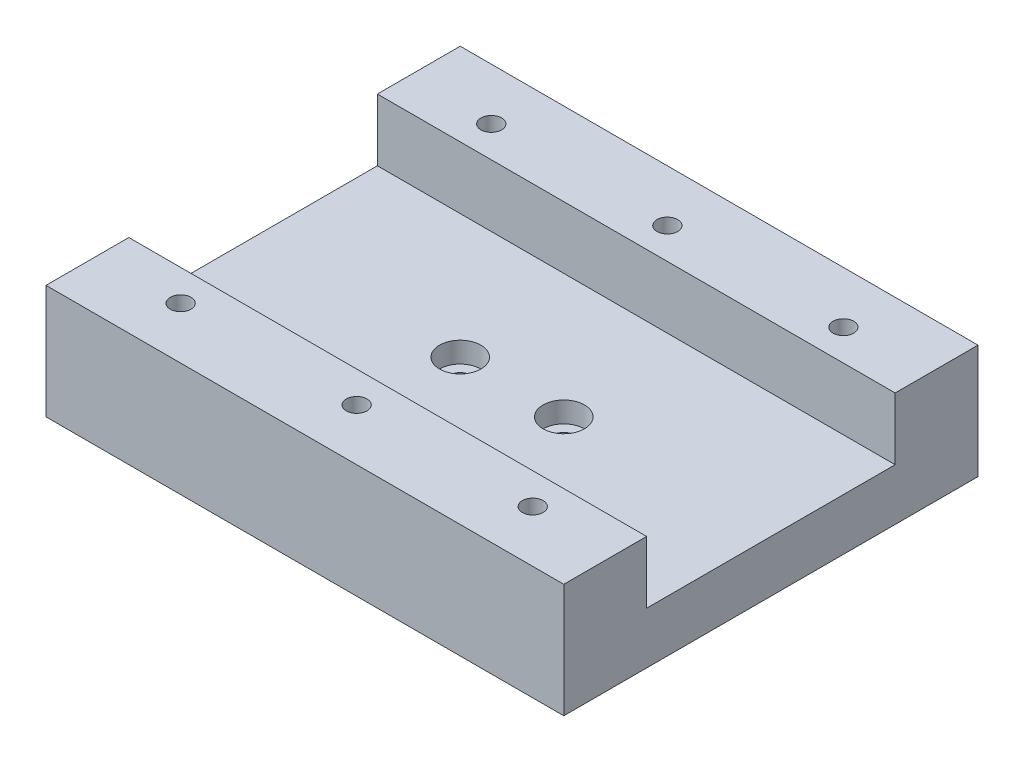
ISO-10303-21;
HEADER;
FILE_DESCRIPTION(('STEP AP214'),'2;1');
FILE_NAME('part.step','',(''),(''),'','','');
FILE_SCHEMA(('AUTOMOTIVE_DESIGN { 1 0 10303 214 1 1 1 1 }'));
ENDSEC;
DATA;
#1=APPLICATION_CONTEXT('core data for automotive mechanical design processes');
#2=APPLICATION_PROTOCOL_DEFINITION('international standard','automotive_design',2000,#1);
#3=PRODUCT_CONTEXT('',#1,'mechanical');
#4=PRODUCT('Part','Part','',(#3));
#5=PRODUCT_RELATED_PRODUCT_CATEGORY('part','',(#4));
#6=PRODUCT_DEFINITION_FORMATION('','',#4);
#7=PRODUCT_DEFINITION_CONTEXT('part definition',#1,'design');
#8=PRODUCT_DEFINITION('design','',#6,#7);
#9=PRODUCT_DEFINITION_SHAPE('','',#8);
#10=(LENGTH_UNIT() NAMED_UNIT(*) SI_UNIT(.MILLI.,.METRE.));
#11=(NAMED_UNIT(*) PLANE_ANGLE_UNIT() SI_UNIT($,.RADIAN.));
#12=(NAMED_UNIT(*) SI_UNIT($,.STERADIAN.) SOLID_ANGLE_UNIT());
#13=UNCERTAINTY_MEASURE_WITH_UNIT(LENGTH_MEASURE(1.E-05),#10,'distance_accuracy_value','');
#14=(GEOMETRIC_REPRESENTATION_CONTEXT(3) GLOBAL_UNCERTAINTY_ASSIGNED_CONTEXT((#13)) GLOBAL_UNIT_ASSIGNED_CONTEXT((#10,
#11,#12)) REPRESENTATION_CONTEXT('',''));
#15=CARTESIAN_POINT('',(0.,0.,0.));
#16=DIRECTION('',(0.,0.,1.));
#17=DIRECTION('',(1.,0.,0.));
#18=AXIS2_PLACEMENT_3D('',#15,#16,#17);
#19=CARTESIAN_POINT('',(0.,5.,0.));
#20=DIRECTION('',(0.,1.,0.));
#21=DIRECTION('',(0.,0.,1.));
#22=AXIS2_PLACEMENT_3D('',#19,#20,#21);
#23=PLANE('',#22);
#24=CARTESIAN_POINT('',(-5.,5.,0.));
#25=DIRECTION('',(0.,1.,0.));
#26=DIRECTION('',(0.,0.,1.));
#27=AXIS2_PLACEMENT_3D('',#24,#25,#26);
#28=CIRCLE('',#27,2.);
#29=CARTESIAN_POINT('',(-5.,5.,2.));
#30=VERTEX_POINT('',#29);
#31=EDGE_CURVE('E156',#30,#30,#28,.T.);
#32=ORIENTED_EDGE('',*,*,#31,.F.);
#33=EDGE_LOOP('',(#32));
#34=FACE_BOUND('',#33,.T.);
#35=CARTESIAN_POINT('',(5.,5.,0.));
#36=DIRECTION('',(0.,1.,0.));
#37=DIRECTION('',(0.,0.,1.));
#38=AXIS2_PLACEMENT_3D('',#35,#36,#37);
#39=CIRCLE('',#38,2.);
#40=CARTESIAN_POINT('',(5.,5.,2.));
#41=VERTEX_POINT('',#40);
#42=EDGE_CURVE('E161',#41,#41,#39,.T.);
#43=ORIENTED_EDGE('',*,*,#42,.F.);
#44=EDGE_LOOP('',(#43));
#45=FACE_BOUND('',#44,.T.);
#46=DIRECTION('',(0.,0.,1.));
#47=VECTOR('',#46,1.);
#48=CARTESIAN_POINT('',(-25.,5.,-20.));
#49=LINE('',#48,#47);
#50=CARTESIAN_POINT('',(-25.,5.,-12.));
#51=VERTEX_POINT('',#50);
#52=CARTESIAN_POINT('',(-25.,5.,12.));
#53=VERTEX_POINT('',#52);
#54=EDGE_CURVE('E121',#51,#53,#49,.T.);
#55=ORIENTED_EDGE('',*,*,#54,.T.);
#56=DIRECTION('',(-1.,0.,0.));
#57=VECTOR('',#56,1.);
#58=CARTESIAN_POINT('',(-25.,5.,12.));
#59=LINE('',#58,#57);
#60=CARTESIAN_POINT('',(25.,5.,12.));
#61=VERTEX_POINT('',#60);
#62=EDGE_CURVE('E110',#61,#53,#59,.T.);
#63=ORIENTED_EDGE('',*,*,#62,.F.);
#64=DIRECTION('',(0.,0.,-1.));
#65=VECTOR('',#64,1.);
#66=CARTESIAN_POINT('',(25.,5.,-20.));
#67=LINE('',#66,#65);
#68=CARTESIAN_POINT('',(25.,5.,-12.));
#69=VERTEX_POINT('',#68);
#70=EDGE_CURVE('E127',#61,#69,#67,.T.);
#71=ORIENTED_EDGE('',*,*,#70,.T.);
#72=DIRECTION('',(1.,0.,0.));
#73=VECTOR('',#72,1.);
#74=CARTESIAN_POINT('',(-25.,5.,-12.));
#75=LINE('',#74,#73);
#76=EDGE_CURVE('E68',#51,#69,#75,.T.);
#77=ORIENTED_EDGE('',*,*,#76,.F.);
#78=EDGE_LOOP('',(#55,#63,#71,#77));
#79=FACE_BOUND('',#78,.T.);
#80=ADVANCED_FACE('F43',(#34,#45,#79),#23,.T.);
#81=CARTESIAN_POINT('',(5.,0.,0.));
#82=DIRECTION('',(0.,1.,0.));
#83=DIRECTION('',(0.,0.,1.));
#84=AXIS2_PLACEMENT_3D('',#81,#82,#83);
#85=CYLINDRICAL_SURFACE('',#84,1.);
#86=CARTESIAN_POINT('',(5.,0.,0.));
#87=DIRECTION('',(0.,1.,0.));
#88=DIRECTION('',(0.,0.,1.));
#89=AXIS2_PLACEMENT_3D('',#86,#87,#88);
#90=CIRCLE('',#89,1.);
#91=CARTESIAN_POINT('',(5.,0.,0.999999999999998));
#92=VERTEX_POINT('',#91);
#93=EDGE_CURVE('E154',#92,#92,#90,.T.);
#94=ORIENTED_EDGE('',*,*,#93,.F.);
#95=EDGE_LOOP('',(#94));
#96=FACE_BOUND('',#95,.T.);
#97=CARTESIAN_POINT('',(5.,3.,0.));
#98=DIRECTION('',(0.,1.,0.));
#99=DIRECTION('',(0.,0.,1.));
#100=AXIS2_PLACEMENT_3D('',#97,#98,#99);
#101=CIRCLE('',#100,1.);
#102=CARTESIAN_POINT('',(5.,3.,0.999999999999998));
#103=VERTEX_POINT('',#102);
#104=EDGE_CURVE('E47',#103,#103,#101,.F.);
#105=ORIENTED_EDGE('',*,*,#104,.F.);
#106=EDGE_LOOP('',(#105));
#107=FACE_BOUND('',#106,.T.);
#108=ADVANCED_FACE('F179',(#96,#107),#85,.F.);
#109=CARTESIAN_POINT('',(-5.,0.,0.));
#110=DIRECTION('',(0.,1.,0.));
#111=DIRECTION('',(0.,0.,1.));
#112=AXIS2_PLACEMENT_3D('',#109,#110,#111);
#113=CYLINDRICAL_SURFACE('',#112,1.);
#114=CARTESIAN_POINT('',(-5.,0.,0.));
#115=DIRECTION('',(0.,1.,0.));
#116=DIRECTION('',(0.,0.,1.));
#117=AXIS2_PLACEMENT_3D('',#114,#115,#116);
#118=CIRCLE('',#117,1.);
#119=CARTESIAN_POINT('',(-5.,0.,1.));
#120=VERTEX_POINT('',#119);
#121=EDGE_CURVE('E140',#120,#120,#118,.T.);
#122=ORIENTED_EDGE('',*,*,#121,.F.);
#123=EDGE_LOOP('',(#122));
#124=FACE_BOUND('',#123,.T.);
#125=CARTESIAN_POINT('',(-5.,3.,0.));
#126=DIRECTION('',(0.,1.,0.));
#127=DIRECTION('',(0.,0.,1.));
#128=AXIS2_PLACEMENT_3D('',#125,#126,#127);
#129=CIRCLE('',#128,1.);
#130=CARTESIAN_POINT('',(-5.,3.,1.));
#131=VERTEX_POINT('',#130);
#132=EDGE_CURVE('E148',#131,#131,#129,.F.);
#133=ORIENTED_EDGE('',*,*,#132,.F.);
#134=EDGE_LOOP('',(#133));
#135=FACE_BOUND('',#134,.T.);
#136=ADVANCED_FACE('F182',(#124,#135),#113,.F.);
#137=CARTESIAN_POINT('',(25.,5.,-20.));
#138=DIRECTION('',(-1.,0.,0.));
#139=DIRECTION('',(0.,0.,1.));
#140=AXIS2_PLACEMENT_3D('',#137,#138,#139);
#141=PLANE('',#140);
#142=DIRECTION('',(0.,0.,-1.));
#143=VECTOR('',#142,1.);
#144=CARTESIAN_POINT('',(25.,0.,-20.));
#145=LINE('',#144,#143);
#146=CARTESIAN_POINT('',(25.,0.,20.));
#147=VERTEX_POINT('',#146);
#148=CARTESIAN_POINT('',(25.,0.,-20.));
#149=VERTEX_POINT('',#148);
#150=EDGE_CURVE('E136',#147,#149,#145,.T.);
#151=ORIENTED_EDGE('',*,*,#150,.T.);
#152=DIRECTION('',(0.,-1.,0.));
#153=VECTOR('',#152,1.);
#154=CARTESIAN_POINT('',(25.,5.,-20.));
#155=LINE('',#154,#153);
#156=CARTESIAN_POINT('',(25.,11.,-20.));
#157=VERTEX_POINT('',#156);
#158=EDGE_CURVE('E11',#157,#149,#155,.T.);
#159=ORIENTED_EDGE('',*,*,#158,.F.);
#160=DIRECTION('',(0.,0.,-1.));
#161=VECTOR('',#160,1.);
#162=CARTESIAN_POINT('',(25.,11.,-20.));
#163=LINE('',#162,#161);
#164=CARTESIAN_POINT('',(25.,11.,-12.));
#165=VERTEX_POINT('',#164);
#166=EDGE_CURVE('E250',#165,#157,#163,.T.);
#167=ORIENTED_EDGE('',*,*,#166,.F.);
#168=DIRECTION('',(0.,-1.,0.));
#169=VECTOR('',#168,1.);
#170=CARTESIAN_POINT('',(25.,11.,-12.));
#171=LINE('',#170,#169);
#172=EDGE_CURVE('E255',#165,#69,#171,.T.);
#173=ORIENTED_EDGE('',*,*,#172,.T.);
#174=ORIENTED_EDGE('',*,*,#70,.F.);
#175=DIRECTION('',(0.,-1.,0.));
#176=VECTOR('',#175,1.);
#177=CARTESIAN_POINT('',(25.,11.,12.));
#178=LINE('',#177,#176);
#179=CARTESIAN_POINT('',(25.,11.,12.));
#180=VERTEX_POINT('',#179);
#181=EDGE_CURVE('E60',#180,#61,#178,.T.);
#182=ORIENTED_EDGE('',*,*,#181,.F.);
#183=DIRECTION('',(0.,0.,-1.));
#184=VECTOR('',#183,1.);
#185=CARTESIAN_POINT('',(25.,11.,20.));
#186=LINE('',#185,#184);
#187=CARTESIAN_POINT('',(25.,11.,20.));
#188=VERTEX_POINT('',#187);
#189=EDGE_CURVE('E239',#188,#180,#186,.T.);
#190=ORIENTED_EDGE('',*,*,#189,.F.);
#191=DIRECTION('',(0.,-1.,0.));
#192=VECTOR('',#191,1.);
#193=CARTESIAN_POINT('',(25.,5.,20.));
#194=LINE('',#193,#192);
#195=EDGE_CURVE('E126',#188,#147,#194,.T.);
#196=ORIENTED_EDGE('',*,*,#195,.T.);
#197=EDGE_LOOP('',(#151,#159,#167,#173,#174,#182,#190,#196));
#198=FACE_BOUND('',#197,.T.);
#199=ADVANCED_FACE('F45',(#198),#141,.F.);
#200=CARTESIAN_POINT('',(-25.,5.,-20.));
#201=DIRECTION('',(0.,0.,1.));
#202=DIRECTION('',(1.,0.,0.));
#203=AXIS2_PLACEMENT_3D('',#200,#201,#202);
#204=PLANE('',#203);
#205=DIRECTION('',(-1.,0.,0.));
#206=VECTOR('',#205,1.);
#207=CARTESIAN_POINT('',(-25.,0.,-20.));
#208=LINE('',#207,#206);
#209=CARTESIAN_POINT('',(-25.,0.,-20.));
#210=VERTEX_POINT('',#209);
#211=EDGE_CURVE('E139',#149,#210,#208,.T.);
#212=ORIENTED_EDGE('',*,*,#211,.T.);
#213=DIRECTION('',(0.,-1.,0.));
#214=VECTOR('',#213,1.);
#215=CARTESIAN_POINT('',(-25.,5.,-20.));
#216=LINE('',#215,#214);
#217=CARTESIAN_POINT('',(-25.,11.,-20.));
#218=VERTEX_POINT('',#217);
#219=EDGE_CURVE('E52',#218,#210,#216,.T.);
#220=ORIENTED_EDGE('',*,*,#219,.F.);
#221=DIRECTION('',(-1.,0.,0.));
#222=VECTOR('',#221,1.);
#223=CARTESIAN_POINT('',(-25.,11.,-20.));
#224=LINE('',#223,#222);
#225=EDGE_CURVE('E253',#157,#218,#224,.T.);
#226=ORIENTED_EDGE('',*,*,#225,.F.);
#227=ORIENTED_EDGE('',*,*,#158,.T.);
#228=EDGE_LOOP('',(#212,#220,#226,#227));
#229=FACE_BOUND('',#228,.T.);
#230=ADVANCED_FACE('F221',(#229),#204,.F.);
#231=CARTESIAN_POINT('',(-25.,5.,-20.));
#232=DIRECTION('',(1.,0.,0.));
#233=DIRECTION('',(0.,0.,-1.));
#234=AXIS2_PLACEMENT_3D('',#231,#232,#233);
#235=PLANE('',#234);
#236=DIRECTION('',(0.,0.,1.));
#237=VECTOR('',#236,1.);
#238=CARTESIAN_POINT('',(-25.,0.,-20.));
#239=LINE('',#238,#237);
#240=CARTESIAN_POINT('',(-25.,0.,20.));
#241=VERTEX_POINT('',#240);
#242=EDGE_CURVE('E142',#210,#241,#239,.T.);
#243=ORIENTED_EDGE('',*,*,#242,.T.);
#244=DIRECTION('',(0.,-1.,0.));
#245=VECTOR('',#244,1.);
#246=CARTESIAN_POINT('',(-25.,5.,20.));
#247=LINE('',#246,#245);
#248=CARTESIAN_POINT('',(-25.,11.,20.));
#249=VERTEX_POINT('',#248);
#250=EDGE_CURVE('E130',#249,#241,#247,.T.);
#251=ORIENTED_EDGE('',*,*,#250,.F.);
#252=DIRECTION('',(0.,0.,1.));
#253=VECTOR('',#252,1.);
#254=CARTESIAN_POINT('',(-25.,11.,20.));
#255=LINE('',#254,#253);
#256=CARTESIAN_POINT('',(-25.,11.,12.));
#257=VERTEX_POINT('',#256);
#258=EDGE_CURVE('E116',#257,#249,#255,.T.);
#259=ORIENTED_EDGE('',*,*,#258,.F.);
#260=DIRECTION('',(0.,-1.,0.));
#261=VECTOR('',#260,1.);
#262=CARTESIAN_POINT('',(-25.,11.,12.));
#263=LINE('',#262,#261);
#264=EDGE_CURVE('E113',#257,#53,#263,.T.);
#265=ORIENTED_EDGE('',*,*,#264,.T.);
#266=ORIENTED_EDGE('',*,*,#54,.F.);
#267=DIRECTION('',(0.,-1.,0.));
#268=VECTOR('',#267,1.);
#269=CARTESIAN_POINT('',(-25.,11.,-12.));
#270=LINE('',#269,#268);
#271=CARTESIAN_POINT('',(-25.,11.,-12.));
#272=VERTEX_POINT('',#271);
#273=EDGE_CURVE('E164',#272,#51,#270,.T.);
#274=ORIENTED_EDGE('',*,*,#273,.F.);
#275=DIRECTION('',(0.,0.,1.));
#276=VECTOR('',#275,1.);
#277=CARTESIAN_POINT('',(-25.,11.,-20.));
#278=LINE('',#277,#276);
#279=EDGE_CURVE('E234',#218,#272,#278,.T.);
#280=ORIENTED_EDGE('',*,*,#279,.F.);
#281=ORIENTED_EDGE('',*,*,#219,.T.);
#282=EDGE_LOOP('',(#243,#251,#259,#265,#266,#274,#280,#281));
#283=FACE_BOUND('',#282,.T.);
#284=ADVANCED_FACE('F119',(#283),#235,.F.);
#285=CARTESIAN_POINT('',(-25.,5.,20.));
#286=DIRECTION('',(0.,0.,-1.));
#287=DIRECTION('',(-1.,0.,0.));
#288=AXIS2_PLACEMENT_3D('',#285,#286,#287);
#289=PLANE('',#288);
#290=DIRECTION('',(1.,0.,0.));
#291=VECTOR('',#290,1.);
#292=CARTESIAN_POINT('',(-25.,0.,20.));
#293=LINE('',#292,#291);
#294=EDGE_CURVE('E132',#241,#147,#293,.T.);
#295=ORIENTED_EDGE('',*,*,#294,.T.);
#296=ORIENTED_EDGE('',*,*,#195,.F.);
#297=DIRECTION('',(1.,0.,0.));
#298=VECTOR('',#297,1.);
#299=CARTESIAN_POINT('',(-25.,11.,20.));
#300=LINE('',#299,#298);
#301=EDGE_CURVE('E241',#249,#188,#300,.T.);
#302=ORIENTED_EDGE('',*,*,#301,.F.);
#303=ORIENTED_EDGE('',*,*,#250,.T.);
#304=EDGE_LOOP('',(#295,#296,#302,#303));
#305=FACE_BOUND('',#304,.T.);
#306=ADVANCED_FACE('F215',(#305),#289,.F.);
#307=CARTESIAN_POINT('',(0.,0.,0.));
#308=DIRECTION('',(0.,1.,0.));
#309=DIRECTION('',(0.,0.,1.));
#310=AXIS2_PLACEMENT_3D('',#307,#308,#309);
#311=PLANE('',#310);
#312=CARTESIAN_POINT('',(0.,0.,-15.));
#313=DIRECTION('',(0.,1.,0.));
#314=DIRECTION('',(0.,0.,1.));
#315=AXIS2_PLACEMENT_3D('',#312,#313,#314);
#316=CIRCLE('',#315,1.);
#317=CARTESIAN_POINT('',(0.,0.,-14.));
#318=VERTEX_POINT('',#317);
#319=EDGE_CURVE('E495',#318,#318,#316,.T.);
#320=ORIENTED_EDGE('',*,*,#319,.T.);
#321=EDGE_LOOP('',(#320));
#322=FACE_BOUND('',#321,.T.);
#323=CARTESIAN_POINT('',(17.,0.,-15.));
#324=DIRECTION('',(0.,1.,0.));
#325=DIRECTION('',(0.,0.,1.));
#326=AXIS2_PLACEMENT_3D('',#323,#324,#325);
#327=CIRCLE('',#326,1.);
#328=CARTESIAN_POINT('',(17.,0.,-14.));
#329=VERTEX_POINT('',#328);
#330=EDGE_CURVE('E507',#329,#329,#327,.T.);
#331=ORIENTED_EDGE('',*,*,#330,.T.);
#332=EDGE_LOOP('',(#331));
#333=FACE_BOUND('',#332,.T.);
#334=CARTESIAN_POINT('',(-17.,0.,15.));
#335=DIRECTION('',(0.,1.,0.));
#336=DIRECTION('',(0.,0.,1.));
#337=AXIS2_PLACEMENT_3D('',#334,#335,#336);
#338=CIRCLE('',#337,1.);
#339=CARTESIAN_POINT('',(-17.,0.,16.));
#340=VERTEX_POINT('',#339);
#341=EDGE_CURVE('E513',#340,#340,#338,.T.);
#342=ORIENTED_EDGE('',*,*,#341,.T.);
#343=EDGE_LOOP('',(#342));
#344=FACE_BOUND('',#343,.T.);
#345=CARTESIAN_POINT('',(0.,0.,15.));
#346=DIRECTION('',(0.,1.,0.));
#347=DIRECTION('',(0.,0.,1.));
#348=AXIS2_PLACEMENT_3D('',#345,#346,#347);
#349=CIRCLE('',#348,1.);
#350=CARTESIAN_POINT('',(0.,0.,16.));
#351=VERTEX_POINT('',#350);
#352=EDGE_CURVE('E519',#351,#351,#349,.T.);
#353=ORIENTED_EDGE('',*,*,#352,.T.);
#354=EDGE_LOOP('',(#353));
#355=FACE_BOUND('',#354,.T.);
#356=CARTESIAN_POINT('',(17.,0.,15.));
#357=DIRECTION('',(0.,1.,0.));
#358=DIRECTION('',(0.,0.,1.));
#359=AXIS2_PLACEMENT_3D('',#356,#357,#358);
#360=CIRCLE('',#359,1.);
#361=CARTESIAN_POINT('',(17.,0.,16.));
#362=VERTEX_POINT('',#361);
#363=EDGE_CURVE('E539',#362,#362,#360,.T.);
#364=ORIENTED_EDGE('',*,*,#363,.T.);
#365=EDGE_LOOP('',(#364));
#366=FACE_BOUND('',#365,.T.);
#367=CARTESIAN_POINT('',(-17.,0.,-15.));
#368=DIRECTION('',(0.,1.,0.));
#369=DIRECTION('',(0.,0.,1.));
#370=AXIS2_PLACEMENT_3D('',#367,#368,#369);
#371=CIRCLE('',#370,1.);
#372=CARTESIAN_POINT('',(-17.,0.,-14.));
#373=VERTEX_POINT('',#372);
#374=EDGE_CURVE('E501',#373,#373,#371,.T.);
#375=ORIENTED_EDGE('',*,*,#374,.T.);
#376=EDGE_LOOP('',(#375));
#377=FACE_BOUND('',#376,.T.);
#378=ORIENTED_EDGE('',*,*,#121,.T.);
#379=EDGE_LOOP('',(#378));
#380=FACE_BOUND('',#379,.T.);
#381=ORIENTED_EDGE('',*,*,#93,.T.);
#382=EDGE_LOOP('',(#381));
#383=FACE_BOUND('',#382,.T.);
#384=ORIENTED_EDGE('',*,*,#150,.F.);
#385=ORIENTED_EDGE('',*,*,#294,.F.);
#386=ORIENTED_EDGE('',*,*,#242,.F.);
#387=ORIENTED_EDGE('',*,*,#211,.F.);
#388=EDGE_LOOP('',(#384,#385,#386,#387));
#389=FACE_BOUND('',#388,.T.);
#390=ADVANCED_FACE('F176',(#322,#333,#344,#355,#366,#377,#380,#383,#389),#311,.F.);
#391=CARTESIAN_POINT('',(-5.,3.,0.));
#392=DIRECTION('',(0.,1.,0.));
#393=DIRECTION('',(0.,0.,1.));
#394=AXIS2_PLACEMENT_3D('',#391,#392,#393);
#395=PLANE('',#394);
#396=CARTESIAN_POINT('',(-5.,3.,0.));
#397=DIRECTION('',(0.,1.,0.));
#398=DIRECTION('',(0.,0.,1.));
#399=AXIS2_PLACEMENT_3D('',#396,#397,#398);
#400=CIRCLE('',#399,2.);
#401=CARTESIAN_POINT('',(-5.,3.,2.));
#402=VERTEX_POINT('',#401);
#403=EDGE_CURVE('E150',#402,#402,#400,.T.);
#404=ORIENTED_EDGE('',*,*,#403,.T.);
#405=EDGE_LOOP('',(#404));
#406=FACE_BOUND('',#405,.T.);
#407=ORIENTED_EDGE('',*,*,#132,.T.);
#408=EDGE_LOOP('',(#407));
#409=FACE_BOUND('',#408,.T.);
#410=ADVANCED_FACE('F199',(#406,#409),#395,.T.);
#411=CARTESIAN_POINT('',(-5.,3.,0.));
#412=DIRECTION('',(0.,1.,0.));
#413=DIRECTION('',(0.,0.,1.));
#414=AXIS2_PLACEMENT_3D('',#411,#412,#413);
#415=CYLINDRICAL_SURFACE('',#414,2.);
#416=ORIENTED_EDGE('',*,*,#403,.F.);
#417=EDGE_LOOP('',(#416));
#418=FACE_BOUND('',#417,.T.);
#419=ORIENTED_EDGE('',*,*,#31,.T.);
#420=EDGE_LOOP('',(#419));
#421=FACE_BOUND('',#420,.T.);
#422=ADVANCED_FACE('F189',(#418,#421),#415,.F.);
#423=CARTESIAN_POINT('',(5.,3.,0.));
#424=DIRECTION('',(0.,1.,0.));
#425=DIRECTION('',(0.,0.,1.));
#426=AXIS2_PLACEMENT_3D('',#423,#424,#425);
#427=PLANE('',#426);
#428=CARTESIAN_POINT('',(5.,3.,0.));
#429=DIRECTION('',(0.,1.,0.));
#430=DIRECTION('',(0.,0.,1.));
#431=AXIS2_PLACEMENT_3D('',#428,#429,#430);
#432=CIRCLE('',#431,2.);
#433=CARTESIAN_POINT('',(5.,3.,2.));
#434=VERTEX_POINT('',#433);
#435=EDGE_CURVE('E169',#434,#434,#432,.T.);
#436=ORIENTED_EDGE('',*,*,#435,.T.);
#437=EDGE_LOOP('',(#436));
#438=FACE_BOUND('',#437,.T.);
#439=ORIENTED_EDGE('',*,*,#104,.T.);
#440=EDGE_LOOP('',(#439));
#441=FACE_BOUND('',#440,.T.);
#442=ADVANCED_FACE('F186',(#438,#441),#427,.T.);
#443=CARTESIAN_POINT('',(5.,3.,0.));
#444=DIRECTION('',(0.,1.,0.));
#445=DIRECTION('',(0.,0.,1.));
#446=AXIS2_PLACEMENT_3D('',#443,#444,#445);
#447=CYLINDRICAL_SURFACE('',#446,2.);
#448=ORIENTED_EDGE('',*,*,#435,.F.);
#449=EDGE_LOOP('',(#448));
#450=FACE_BOUND('',#449,.T.);
#451=ORIENTED_EDGE('',*,*,#42,.T.);
#452=EDGE_LOOP('',(#451));
#453=FACE_BOUND('',#452,.T.);
#454=ADVANCED_FACE('F188',(#450,#453),#447,.F.);
#455=CARTESIAN_POINT('',(-25.,11.,-12.));
#456=DIRECTION('',(0.,0.,-1.));
#457=DIRECTION('',(-1.,0.,0.));
#458=AXIS2_PLACEMENT_3D('',#455,#456,#457);
#459=PLANE('',#458);
#460=ORIENTED_EDGE('',*,*,#76,.T.);
#461=ORIENTED_EDGE('',*,*,#172,.F.);
#462=DIRECTION('',(1.,0.,0.));
#463=VECTOR('',#462,1.);
#464=CARTESIAN_POINT('',(-25.,11.,-12.));
#465=LINE('',#464,#463);
#466=EDGE_CURVE('E248',#272,#165,#465,.T.);
#467=ORIENTED_EDGE('',*,*,#466,.F.);
#468=ORIENTED_EDGE('',*,*,#273,.T.);
#469=EDGE_LOOP('',(#460,#461,#467,#468));
#470=FACE_BOUND('',#469,.T.);
#471=ADVANCED_FACE('F196',(#470),#459,.F.);
#472=CARTESIAN_POINT('',(0.,11.,0.));
#473=DIRECTION('',(0.,1.,0.));
#474=DIRECTION('',(0.,0.,1.));
#475=AXIS2_PLACEMENT_3D('',#472,#473,#474);
#476=PLANE('',#475);
#477=CARTESIAN_POINT('',(0.,11.,-15.));
#478=DIRECTION('',(0.,1.,0.));
#479=DIRECTION('',(0.,0.,1.));
#480=AXIS2_PLACEMENT_3D('',#477,#478,#479);
#481=CIRCLE('',#480,1.);
#482=CARTESIAN_POINT('',(0.,11.,-14.));
#483=VERTEX_POINT('',#482);
#484=EDGE_CURVE('E497',#483,#483,#481,.T.);
#485=ORIENTED_EDGE('',*,*,#484,.F.);
#486=EDGE_LOOP('',(#485));
#487=FACE_BOUND('',#486,.T.);
#488=CARTESIAN_POINT('',(17.,11.,-15.));
#489=DIRECTION('',(0.,1.,0.));
#490=DIRECTION('',(0.,0.,1.));
#491=AXIS2_PLACEMENT_3D('',#488,#489,#490);
#492=CIRCLE('',#491,1.);
#493=CARTESIAN_POINT('',(17.,11.,-14.));
#494=VERTEX_POINT('',#493);
#495=EDGE_CURVE('E503',#494,#494,#492,.T.);
#496=ORIENTED_EDGE('',*,*,#495,.F.);
#497=EDGE_LOOP('',(#496));
#498=FACE_BOUND('',#497,.T.);
#499=CARTESIAN_POINT('',(-17.,11.,-15.));
#500=DIRECTION('',(0.,1.,0.));
#501=DIRECTION('',(0.,0.,1.));
#502=AXIS2_PLACEMENT_3D('',#499,#500,#501);
#503=CIRCLE('',#502,1.);
#504=CARTESIAN_POINT('',(-17.,11.,-14.));
#505=VERTEX_POINT('',#504);
#506=EDGE_CURVE('E498',#505,#505,#503,.T.);
#507=ORIENTED_EDGE('',*,*,#506,.F.);
#508=EDGE_LOOP('',(#507));
#509=FACE_BOUND('',#508,.T.);
#510=ORIENTED_EDGE('',*,*,#279,.T.);
#511=ORIENTED_EDGE('',*,*,#466,.T.);
#512=ORIENTED_EDGE('',*,*,#166,.T.);
#513=ORIENTED_EDGE('',*,*,#225,.T.);
#514=EDGE_LOOP('',(#510,#511,#512,#513));
#515=FACE_BOUND('',#514,.T.);
#516=ADVANCED_FACE('F261',(#487,#498,#509,#515),#476,.T.);
#517=CARTESIAN_POINT('',(-25.,11.,12.));
#518=DIRECTION('',(0.,0.,1.));
#519=DIRECTION('',(1.,0.,0.));
#520=AXIS2_PLACEMENT_3D('',#517,#518,#519);
#521=PLANE('',#520);
#522=ORIENTED_EDGE('',*,*,#62,.T.);
#523=ORIENTED_EDGE('',*,*,#264,.F.);
#524=DIRECTION('',(-1.,0.,0.));
#525=VECTOR('',#524,1.);
#526=CARTESIAN_POINT('',(-25.,11.,12.));
#527=LINE('',#526,#525);
#528=EDGE_CURVE('E124',#180,#257,#527,.T.);
#529=ORIENTED_EDGE('',*,*,#528,.F.);
#530=ORIENTED_EDGE('',*,*,#181,.T.);
#531=EDGE_LOOP('',(#522,#523,#529,#530));
#532=FACE_BOUND('',#531,.T.);
#533=ADVANCED_FACE('F112',(#532),#521,.F.);
#534=CARTESIAN_POINT('',(0.,11.,0.));
#535=DIRECTION('',(0.,-1.,0.));
#536=DIRECTION('',(0.,0.,-1.));
#537=AXIS2_PLACEMENT_3D('',#534,#535,#536);
#538=PLANE('',#537);
#539=CARTESIAN_POINT('',(-17.,11.,15.));
#540=DIRECTION('',(0.,1.,0.));
#541=DIRECTION('',(0.,0.,1.));
#542=AXIS2_PLACEMENT_3D('',#539,#540,#541);
#543=CIRCLE('',#542,1.);
#544=CARTESIAN_POINT('',(-17.,11.,16.));
#545=VERTEX_POINT('',#544);
#546=EDGE_CURVE('E510',#545,#545,#543,.T.);
#547=ORIENTED_EDGE('',*,*,#546,.F.);
#548=EDGE_LOOP('',(#547));
#549=FACE_BOUND('',#548,.T.);
#550=CARTESIAN_POINT('',(0.,11.,15.));
#551=DIRECTION('',(0.,1.,0.));
#552=DIRECTION('',(0.,0.,1.));
#553=AXIS2_PLACEMENT_3D('',#550,#551,#552);
#554=CIRCLE('',#553,1.);
#555=CARTESIAN_POINT('',(0.,11.,16.));
#556=VERTEX_POINT('',#555);
#557=EDGE_CURVE('E516',#556,#556,#554,.T.);
#558=ORIENTED_EDGE('',*,*,#557,.F.);
#559=EDGE_LOOP('',(#558));
#560=FACE_BOUND('',#559,.T.);
#561=CARTESIAN_POINT('',(17.,11.,15.));
#562=DIRECTION('',(0.,1.,0.));
#563=DIRECTION('',(0.,0.,1.));
#564=AXIS2_PLACEMENT_3D('',#561,#562,#563);
#565=CIRCLE('',#564,1.);
#566=CARTESIAN_POINT('',(17.,11.,16.));
#567=VERTEX_POINT('',#566);
#568=EDGE_CURVE('E522',#567,#567,#565,.T.);
#569=ORIENTED_EDGE('',*,*,#568,.F.);
#570=EDGE_LOOP('',(#569));
#571=FACE_BOUND('',#570,.T.);
#572=ORIENTED_EDGE('',*,*,#258,.T.);
#573=ORIENTED_EDGE('',*,*,#301,.T.);
#574=ORIENTED_EDGE('',*,*,#189,.T.);
#575=ORIENTED_EDGE('',*,*,#528,.T.);
#576=EDGE_LOOP('',(#572,#573,#574,#575));
#577=FACE_BOUND('',#576,.T.);
#578=ADVANCED_FACE('F269',(#549,#560,#571,#577),#538,.F.);
#579=CARTESIAN_POINT('',(17.,0.,15.));
#580=DIRECTION('',(0.,1.,0.));
#581=DIRECTION('',(0.,0.,1.));
#582=AXIS2_PLACEMENT_3D('',#579,#580,#581);
#583=CYLINDRICAL_SURFACE('',#582,1.);
#584=ORIENTED_EDGE('',*,*,#363,.F.);
#585=EDGE_LOOP('',(#584));
#586=FACE_BOUND('',#585,.T.);
#587=ORIENTED_EDGE('',*,*,#568,.T.);
#588=EDGE_LOOP('',(#587));
#589=FACE_BOUND('',#588,.T.);
#590=ADVANCED_FACE('F362',(#586,#589),#583,.F.);
#591=CARTESIAN_POINT('',(0.,0.,15.));
#592=DIRECTION('',(0.,1.,0.));
#593=DIRECTION('',(0.,0.,1.));
#594=AXIS2_PLACEMENT_3D('',#591,#592,#593);
#595=CYLINDRICAL_SURFACE('',#594,1.);
#596=ORIENTED_EDGE('',*,*,#352,.F.);
#597=EDGE_LOOP('',(#596));
#598=FACE_BOUND('',#597,.T.);
#599=ORIENTED_EDGE('',*,*,#557,.T.);
#600=EDGE_LOOP('',(#599));
#601=FACE_BOUND('',#600,.T.);
#602=ADVANCED_FACE('F372',(#598,#601),#595,.F.);
#603=CARTESIAN_POINT('',(-17.,0.,15.));
#604=DIRECTION('',(0.,1.,0.));
#605=DIRECTION('',(0.,0.,1.));
#606=AXIS2_PLACEMENT_3D('',#603,#604,#605);
#607=CYLINDRICAL_SURFACE('',#606,1.);
#608=ORIENTED_EDGE('',*,*,#341,.F.);
#609=EDGE_LOOP('',(#608));
#610=FACE_BOUND('',#609,.T.);
#611=ORIENTED_EDGE('',*,*,#546,.T.);
#612=EDGE_LOOP('',(#611));
#613=FACE_BOUND('',#612,.T.);
#614=ADVANCED_FACE('F383',(#610,#613),#607,.F.);
#615=CARTESIAN_POINT('',(-17.,0.,-15.));
#616=DIRECTION('',(0.,1.,0.));
#617=DIRECTION('',(0.,0.,1.));
#618=AXIS2_PLACEMENT_3D('',#615,#616,#617);
#619=CYLINDRICAL_SURFACE('',#618,1.);
#620=ORIENTED_EDGE('',*,*,#374,.F.);
#621=EDGE_LOOP('',(#620));
#622=FACE_BOUND('',#621,.T.);
#623=ORIENTED_EDGE('',*,*,#506,.T.);
#624=EDGE_LOOP('',(#623));
#625=FACE_BOUND('',#624,.T.);
#626=ADVANCED_FACE('F394',(#622,#625),#619,.F.);
#627=CARTESIAN_POINT('',(17.,0.,-15.));
#628=DIRECTION('',(0.,1.,0.));
#629=DIRECTION('',(0.,0.,1.));
#630=AXIS2_PLACEMENT_3D('',#627,#628,#629);
#631=CYLINDRICAL_SURFACE('',#630,1.);
#632=ORIENTED_EDGE('',*,*,#330,.F.);
#633=EDGE_LOOP('',(#632));
#634=FACE_BOUND('',#633,.T.);
#635=ORIENTED_EDGE('',*,*,#495,.T.);
#636=EDGE_LOOP('',(#635));
#637=FACE_BOUND('',#636,.T.);
#638=ADVANCED_FACE('F405',(#634,#637),#631,.F.);
#639=CARTESIAN_POINT('',(0.,0.,-15.));
#640=DIRECTION('',(0.,1.,0.));
#641=DIRECTION('',(0.,0.,1.));
#642=AXIS2_PLACEMENT_3D('',#639,#640,#641);
#643=CYLINDRICAL_SURFACE('',#642,1.);
#644=ORIENTED_EDGE('',*,*,#319,.F.);
#645=EDGE_LOOP('',(#644));
#646=FACE_BOUND('',#645,.T.);
#647=ORIENTED_EDGE('',*,*,#484,.T.);
#648=EDGE_LOOP('',(#647));
#649=FACE_BOUND('',#648,.T.);
#650=ADVANCED_FACE('F416',(#646,#649),#643,.F.);
#651=CLOSED_SHELL('',(#80,#108,#136,#199,#230,#284,#306,#390,#410,#422,#442,#454,#471,#516,#533,
#578,#590,#602,#614,#626,#638,#650));
#652=MANIFOLD_SOLID_BREP('B2',#651);
#653=ADVANCED_BREP_SHAPE_REPRESENTATION('',(#18,#652),#14);
#654=SHAPE_DEFINITION_REPRESENTATION(#9,#653);
ENDSEC;
END-ISO-10303-21;
